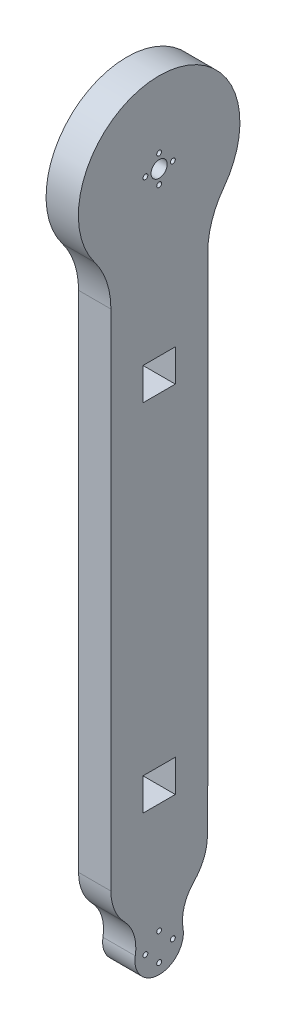
ISO-10303-21;
HEADER;
FILE_DESCRIPTION(('STEP AP214'),'2;1');
FILE_NAME('part.step','',(''),(''),'','','');
FILE_SCHEMA(('AUTOMOTIVE_DESIGN { 1 0 10303 214 1 1 1 1 }'));
ENDSEC;
DATA;
#1=APPLICATION_CONTEXT('core data for automotive mechanical design processes');
#2=APPLICATION_PROTOCOL_DEFINITION('international standard','automotive_design',2000,#1);
#3=PRODUCT_CONTEXT('',#1,'mechanical');
#4=PRODUCT('Part','Part','',(#3));
#5=PRODUCT_RELATED_PRODUCT_CATEGORY('part','',(#4));
#6=PRODUCT_DEFINITION_FORMATION('','',#4);
#7=PRODUCT_DEFINITION_CONTEXT('part definition',#1,'design');
#8=PRODUCT_DEFINITION('design','',#6,#7);
#9=PRODUCT_DEFINITION_SHAPE('','',#8);
#10=(LENGTH_UNIT() NAMED_UNIT(*) SI_UNIT(.MILLI.,.METRE.));
#11=(NAMED_UNIT(*) PLANE_ANGLE_UNIT() SI_UNIT($,.RADIAN.));
#12=(NAMED_UNIT(*) SI_UNIT($,.STERADIAN.) SOLID_ANGLE_UNIT());
#13=UNCERTAINTY_MEASURE_WITH_UNIT(LENGTH_MEASURE(1.E-05),#10,'distance_accuracy_value','');
#14=(GEOMETRIC_REPRESENTATION_CONTEXT(3) GLOBAL_UNCERTAINTY_ASSIGNED_CONTEXT((#13)) GLOBAL_UNIT_ASSIGNED_CONTEXT((#10,
#11,#12)) REPRESENTATION_CONTEXT('',''));
#15=CARTESIAN_POINT('',(0.,0.,0.));
#16=DIRECTION('',(0.,0.,1.));
#17=DIRECTION('',(1.,0.,0.));
#18=AXIS2_PLACEMENT_3D('',#15,#16,#17);
#19=CARTESIAN_POINT('',(10.,109.060958061261,55.));
#20=DIRECTION('',(1.,0.,0.));
#21=DIRECTION('',(0.,0.,-1.));
#22=AXIS2_PLACEMENT_3D('',#19,#20,#21);
#23=PLANE('',#22);
#24=CARTESIAN_POINT('',(10.,139.147777588755,15.0611722663843));
#25=DIRECTION('',(1.,0.,0.));
#26=DIRECTION('',(0.,0.,-1.));
#27=AXIS2_PLACEMENT_3D('',#24,#25,#26);
#28=CIRCLE('',#27,2.5);
#29=CARTESIAN_POINT('',(10.,139.147777588755,12.5611722663843));
#30=VERTEX_POINT('',#29);
#31=EDGE_CURVE('E199',#30,#30,#28,.T.);
#32=ORIENTED_EDGE('',*,*,#31,.F.);
#33=EDGE_LOOP('',(#32));
#34=FACE_BOUND('',#33,.T.);
#35=DIRECTION('',(0.,0.,1.));
#36=VECTOR('',#35,1.);
#37=CARTESIAN_POINT('',(10.,-33.7397338832662,0.));
#38=LINE('',#37,#36);
#39=CARTESIAN_POINT('',(10.,-33.7397338832662,0.));
#40=VERTEX_POINT('',#39);
#41=CARTESIAN_POINT('',(10.,-33.7397338832662,0.122344532768711));
#42=VERTEX_POINT('',#41);
#43=EDGE_CURVE('E173',#40,#42,#38,.T.);
#44=ORIENTED_EDGE('',*,*,#43,.F.);
#45=DIRECTION('',(0.,1.,0.));
#46=VECTOR('',#45,1.);
#47=CARTESIAN_POINT('',(10.,109.224055449648,0.));
#48=LINE('',#47,#46);
#49=CARTESIAN_POINT('',(10.,109.224055449648,0.));
#50=VERTEX_POINT('',#49);
#51=EDGE_CURVE('E354',#40,#50,#48,.T.);
#52=ORIENTED_EDGE('',*,*,#51,.T.);
#53=CARTESIAN_POINT('',(10.,109.224055449648,-25.));
#54=DIRECTION('',(-1.,0.,0.));
#55=DIRECTION('',(0.,0.,1.));
#56=AXIS2_PLACEMENT_3D('',#53,#54,#55);
#57=CIRCLE('',#56,25.);
#58=CARTESIAN_POINT('',(10.,124.184939096712,-4.97072241694613));
#59=VERTEX_POINT('',#58);
#60=EDGE_CURVE('E356',#50,#59,#57,.T.);
#61=ORIENTED_EDGE('',*,*,#60,.T.);
#62=CARTESIAN_POINT('',(10.,139.147777588755,15.0611722663843));
#63=DIRECTION('',(1.,0.,0.));
#64=DIRECTION('',(0.,0.,-1.));
#65=AXIS2_PLACEMENT_3D('',#62,#63,#64);
#66=CIRCLE('',#65,25.0032665934477);
#67=CARTESIAN_POINT('',(10.,124.103385075138,35.0318906870931));
#68=VERTEX_POINT('',#67);
#69=EDGE_CURVE('E358',#59,#68,#66,.T.);
#70=ORIENTED_EDGE('',*,*,#69,.T.);
#71=CARTESIAN_POINT('',(10.,109.060958061261,55.));
#72=DIRECTION('',(-1.,0.,0.));
#73=DIRECTION('',(0.,0.,-1.));
#74=AXIS2_PLACEMENT_3D('',#71,#72,#73);
#75=CIRCLE('',#74,25.);
#76=CARTESIAN_POINT('',(10.,109.060958061261,30.));
#77=VERTEX_POINT('',#76);
#78=EDGE_CURVE('E348',#68,#77,#75,.T.);
#79=ORIENTED_EDGE('',*,*,#78,.T.);
#80=DIRECTION('',(0.,-1.,0.));
#81=VECTOR('',#80,1.);
#82=CARTESIAN_POINT('',(10.,109.060958061261,30.));
#83=LINE('',#82,#81);
#84=CARTESIAN_POINT('',(10.,-46.9560717726586,30.));
#85=VERTEX_POINT('',#84);
#86=EDGE_CURVE('E351',#77,#85,#83,.T.);
#87=ORIENTED_EDGE('',*,*,#86,.T.);
#88=CARTESIAN_POINT('',(10.,-46.9560717726587,15.1038493614138));
#89=DIRECTION('',(1.,0.,0.));
#90=DIRECTION('',(0.,0.,-1.));
#91=AXIS2_PLACEMENT_3D('',#88,#89,#90);
#92=CIRCLE('',#91,14.8961506385862);
#93=CARTESIAN_POINT('',(10.,-57.3205261052865,25.8030731759867));
#94=VERTEX_POINT('',#93);
#95=EDGE_CURVE('E193',#94,#85,#92,.F.);
#96=ORIENTED_EDGE('',*,*,#95,.F.);
#97=CARTESIAN_POINT('',(10.,-66.017785034869,34.7812515609264));
#98=DIRECTION('',(1.,0.,0.));
#99=DIRECTION('',(0.,0.,-1.));
#100=AXIS2_PLACEMENT_3D('',#97,#98,#99);
#101=CIRCLE('',#100,12.5);
#102=CARTESIAN_POINT('',(10.,-68.1018083951039,22.4562020018376));
#103=VERTEX_POINT('',#102);
#104=EDGE_CURVE('E196',#103,#94,#101,.T.);
#105=ORIENTED_EDGE('',*,*,#104,.F.);
#106=CARTESIAN_POINT('',(10.,-69.3522224112449,15.0611722663843));
#107=DIRECTION('',(1.,0.,0.));
#108=DIRECTION('',(0.,0.,-1.));
#109=AXIS2_PLACEMENT_3D('',#106,#107,#108);
#110=CIRCLE('',#109,7.5);
#111=CARTESIAN_POINT('',(10.,-68.1018083951039,7.66614253093106));
#112=VERTEX_POINT('',#111);
#113=EDGE_CURVE('E222',#103,#112,#110,.T.);
#114=ORIENTED_EDGE('',*,*,#113,.T.);
#115=CARTESIAN_POINT('',(10.,-66.0177850348689,-4.65890702815774));
#116=DIRECTION('',(1.,0.,0.));
#117=DIRECTION('',(0.,0.,-1.));
#118=AXIS2_PLACEMENT_3D('',#115,#116,#117);
#119=CIRCLE('',#118,12.5);
#120=CARTESIAN_POINT('',(10.,-57.3205261052865,4.31927135678201));
#121=VERTEX_POINT('',#120);
#122=EDGE_CURVE('E219',#112,#121,#119,.F.);
#123=ORIENTED_EDGE('',*,*,#122,.T.);
#124=CARTESIAN_POINT('',(10.,-46.9560717726587,15.0184951713549));
#125=DIRECTION('',(1.,0.,0.));
#126=DIRECTION('',(0.,0.,-1.));
#127=AXIS2_PLACEMENT_3D('',#124,#125,#126);
#128=CIRCLE('',#127,14.8961506385862);
#129=CARTESIAN_POINT('',(10.,-46.9560717726586,0.122344532768704));
#130=VERTEX_POINT('',#129);
#131=EDGE_CURVE('E216',#121,#130,#128,.T.);
#132=ORIENTED_EDGE('',*,*,#131,.T.);
#133=DIRECTION('',(0.,-1.,0.));
#134=VECTOR('',#133,1.);
#135=CARTESIAN_POINT('',(10.,0.,0.122344532768729));
#136=LINE('',#135,#134);
#137=EDGE_CURVE('E213',#42,#130,#136,.T.);
#138=ORIENTED_EDGE('',*,*,#137,.F.);
#139=EDGE_LOOP('',(#44,#52,#61,#70,#79,#87,#96,#105,#114,#123,#132,#138));
#140=FACE_BOUND('',#139,.T.);
#141=CARTESIAN_POINT('',(10.,-69.3522224112449,19.3111722663843));
#142=DIRECTION('',(1.,0.,0.));
#143=DIRECTION('',(0.,0.,-1.));
#144=AXIS2_PLACEMENT_3D('',#141,#142,#143);
#145=CIRCLE('',#144,0.750000000000002);
#146=CARTESIAN_POINT('',(10.,-69.3522224112449,18.5611722663843));
#147=VERTEX_POINT('',#146);
#148=EDGE_CURVE('E244',#147,#147,#145,.T.);
#149=ORIENTED_EDGE('',*,*,#148,.F.);
#150=EDGE_LOOP('',(#149));
#151=FACE_BOUND('',#150,.T.);
#152=CARTESIAN_POINT('',(10.,-69.3522224112449,10.8111722663843));
#153=DIRECTION('',(1.,0.,0.));
#154=DIRECTION('',(0.,0.,-1.));
#155=AXIS2_PLACEMENT_3D('',#152,#153,#154);
#156=CIRCLE('',#155,0.75);
#157=CARTESIAN_POINT('',(10.,-69.3522224112449,10.0611722663843));
#158=VERTEX_POINT('',#157);
#159=EDGE_CURVE('E250',#158,#158,#156,.T.);
#160=ORIENTED_EDGE('',*,*,#159,.F.);
#161=EDGE_LOOP('',(#160));
#162=FACE_BOUND('',#161,.T.);
#163=CARTESIAN_POINT('',(10.,-73.6022224112449,15.0611722663843));
#164=DIRECTION('',(1.,0.,0.));
#165=DIRECTION('',(0.,0.,-1.));
#166=AXIS2_PLACEMENT_3D('',#163,#164,#165);
#167=CIRCLE('',#166,0.75);
#168=CARTESIAN_POINT('',(10.,-73.6022224112449,14.3111722663843));
#169=VERTEX_POINT('',#168);
#170=EDGE_CURVE('E230',#169,#169,#167,.T.);
#171=ORIENTED_EDGE('',*,*,#170,.F.);
#172=EDGE_LOOP('',(#171));
#173=FACE_BOUND('',#172,.T.);
#174=CARTESIAN_POINT('',(10.,-65.1022224112449,15.0611722663843));
#175=DIRECTION('',(1.,0.,0.));
#176=DIRECTION('',(0.,0.,-1.));
#177=AXIS2_PLACEMENT_3D('',#174,#175,#176);
#178=CIRCLE('',#177,0.75);
#179=CARTESIAN_POINT('',(10.,-65.1022224112449,14.3111722663843));
#180=VERTEX_POINT('',#179);
#181=EDGE_CURVE('E243',#180,#180,#178,.T.);
#182=ORIENTED_EDGE('',*,*,#181,.F.);
#183=EDGE_LOOP('',(#182));
#184=FACE_BOUND('',#183,.T.);
#185=CARTESIAN_POINT('',(10.,143.397777588755,15.0611722663843));
#186=DIRECTION('',(1.,0.,0.));
#187=DIRECTION('',(0.,0.,-1.));
#188=AXIS2_PLACEMENT_3D('',#185,#186,#187);
#189=CIRCLE('',#188,0.75);
#190=CARTESIAN_POINT('',(10.,143.397777588755,14.3111722663843));
#191=VERTEX_POINT('',#190);
#192=EDGE_CURVE('E268',#191,#191,#189,.T.);
#193=ORIENTED_EDGE('',*,*,#192,.F.);
#194=EDGE_LOOP('',(#193));
#195=FACE_BOUND('',#194,.T.);
#196=CARTESIAN_POINT('',(10.,139.147777588755,10.8111722663843));
#197=DIRECTION('',(1.,0.,0.));
#198=DIRECTION('',(0.,0.,-1.));
#199=AXIS2_PLACEMENT_3D('',#196,#197,#198);
#200=CIRCLE('',#199,0.75);
#201=CARTESIAN_POINT('',(10.,139.147777588755,10.0611722663843));
#202=VERTEX_POINT('',#201);
#203=EDGE_CURVE('E274',#202,#202,#200,.T.);
#204=ORIENTED_EDGE('',*,*,#203,.F.);
#205=EDGE_LOOP('',(#204));
#206=FACE_BOUND('',#205,.T.);
#207=CARTESIAN_POINT('',(10.,134.897777588755,15.0611722663843));
#208=DIRECTION('',(1.,0.,0.));
#209=DIRECTION('',(0.,0.,-1.));
#210=AXIS2_PLACEMENT_3D('',#207,#208,#209);
#211=CIRCLE('',#210,0.75);
#212=CARTESIAN_POINT('',(10.,134.897777588755,14.3111722663843));
#213=VERTEX_POINT('',#212);
#214=EDGE_CURVE('E261',#213,#213,#211,.T.);
#215=ORIENTED_EDGE('',*,*,#214,.F.);
#216=EDGE_LOOP('',(#215));
#217=FACE_BOUND('',#216,.T.);
#218=CARTESIAN_POINT('',(10.,139.147777588755,19.3111722663843));
#219=DIRECTION('',(1.,0.,0.));
#220=DIRECTION('',(0.,0.,-1.));
#221=AXIS2_PLACEMENT_3D('',#218,#219,#220);
#222=CIRCLE('',#221,0.750000000000002);
#223=CARTESIAN_POINT('',(10.,139.147777588755,18.5611722663843));
#224=VERTEX_POINT('',#223);
#225=EDGE_CURVE('E267',#224,#224,#222,.T.);
#226=ORIENTED_EDGE('',*,*,#225,.F.);
#227=EDGE_LOOP('',(#226));
#228=FACE_BOUND('',#227,.T.);
#229=DIRECTION('',(0.,0.,-1.));
#230=VECTOR('',#229,1.);
#231=CARTESIAN_POINT('',(10.,78.9590862581429,10.0611722663844));
#232=LINE('',#231,#230);
#233=CARTESIAN_POINT('',(10.,78.9590862581429,20.0611722663844));
#234=VERTEX_POINT('',#233);
#235=CARTESIAN_POINT('',(10.,78.9590862581429,10.0611722663844));
#236=VERTEX_POINT('',#235);
#237=EDGE_CURVE('E319',#234,#236,#232,.T.);
#238=ORIENTED_EDGE('',*,*,#237,.F.);
#239=DIRECTION('',(0.,-1.,0.));
#240=VECTOR('',#239,1.);
#241=CARTESIAN_POINT('',(10.,78.9590862581429,20.0611722663844));
#242=LINE('',#241,#240);
#243=CARTESIAN_POINT('',(10.,88.9590862581429,20.0611722663844));
#244=VERTEX_POINT('',#243);
#245=EDGE_CURVE('E317',#244,#234,#242,.T.);
#246=ORIENTED_EDGE('',*,*,#245,.F.);
#247=DIRECTION('',(0.,0.,1.));
#248=VECTOR('',#247,1.);
#249=CARTESIAN_POINT('',(10.,88.9590862581429,20.0611722663844));
#250=LINE('',#249,#248);
#251=CARTESIAN_POINT('',(10.,88.9590862581429,10.0611722663844));
#252=VERTEX_POINT('',#251);
#253=EDGE_CURVE('E325',#252,#244,#250,.T.);
#254=ORIENTED_EDGE('',*,*,#253,.F.);
#255=DIRECTION('',(0.,1.,0.));
#256=VECTOR('',#255,1.);
#257=CARTESIAN_POINT('',(10.,88.9590862581429,10.0611722663844));
#258=LINE('',#257,#256);
#259=EDGE_CURVE('E322',#236,#252,#258,.T.);
#260=ORIENTED_EDGE('',*,*,#259,.F.);
#261=EDGE_LOOP('',(#238,#246,#254,#260));
#262=FACE_BOUND('',#261,.T.);
#263=DIRECTION('',(0.,0.,1.));
#264=VECTOR('',#263,1.);
#265=CARTESIAN_POINT('',(10.,-21.0409137418571,10.0611722663844));
#266=LINE('',#265,#264);
#267=CARTESIAN_POINT('',(10.,-21.0409137418571,10.0611722663844));
#268=VERTEX_POINT('',#267);
#269=CARTESIAN_POINT('',(10.,-21.0409137418571,20.0611722663844));
#270=VERTEX_POINT('',#269);
#271=EDGE_CURVE('E290',#268,#270,#266,.T.);
#272=ORIENTED_EDGE('',*,*,#271,.F.);
#273=DIRECTION('',(0.,1.,0.));
#274=VECTOR('',#273,1.);
#275=CARTESIAN_POINT('',(10.,-31.0409137418571,10.0611722663843));
#276=LINE('',#275,#274);
#277=CARTESIAN_POINT('',(10.,-31.0409137418571,10.0611722663843));
#278=VERTEX_POINT('',#277);
#279=EDGE_CURVE('E288',#278,#268,#276,.T.);
#280=ORIENTED_EDGE('',*,*,#279,.F.);
#281=DIRECTION('',(0.,0.,-1.));
#282=VECTOR('',#281,1.);
#283=CARTESIAN_POINT('',(10.,-31.0409137418571,20.0611722663843));
#284=LINE('',#283,#282);
#285=CARTESIAN_POINT('',(10.,-31.0409137418571,20.0611722663843));
#286=VERTEX_POINT('',#285);
#287=EDGE_CURVE('E295',#286,#278,#284,.T.);
#288=ORIENTED_EDGE('',*,*,#287,.F.);
#289=DIRECTION('',(0.,-1.,0.));
#290=VECTOR('',#289,1.);
#291=CARTESIAN_POINT('',(10.,-21.0409137418571,20.0611722663844));
#292=LINE('',#291,#290);
#293=EDGE_CURVE('E293',#270,#286,#292,.T.);
#294=ORIENTED_EDGE('',*,*,#293,.F.);
#295=EDGE_LOOP('',(#272,#280,#288,#294));
#296=FACE_BOUND('',#295,.T.);
#297=ADVANCED_FACE('F35',(#34,#140,#151,#162,#173,#184,#195,#206,#217,#228,#262,#296),#23,.T.);
#298=CARTESIAN_POINT('',(0.,109.060958061261,55.));
#299=DIRECTION('',(1.,0.,0.));
#300=DIRECTION('',(0.,0.,-1.));
#301=AXIS2_PLACEMENT_3D('',#298,#299,#300);
#302=PLANE('',#301);
#303=CARTESIAN_POINT('',(0.,139.147777588755,15.0611722663843));
#304=DIRECTION('',(1.,0.,0.));
#305=DIRECTION('',(0.,0.,-1.));
#306=AXIS2_PLACEMENT_3D('',#303,#304,#305);
#307=CIRCLE('',#306,2.5);
#308=CARTESIAN_POINT('',(0.,139.147777588755,12.5611722663843));
#309=VERTEX_POINT('',#308);
#310=EDGE_CURVE('E214',#309,#309,#307,.T.);
#311=ORIENTED_EDGE('',*,*,#310,.T.);
#312=EDGE_LOOP('',(#311));
#313=FACE_BOUND('',#312,.T.);
#314=CARTESIAN_POINT('',(0.,-69.3522224112449,19.3111722663843));
#315=DIRECTION('',(1.,0.,0.));
#316=DIRECTION('',(0.,0.,-1.));
#317=AXIS2_PLACEMENT_3D('',#314,#315,#316);
#318=CIRCLE('',#317,0.750000000000002);
#319=CARTESIAN_POINT('',(0.,-69.3522224112449,18.5611722663843));
#320=VERTEX_POINT('',#319);
#321=EDGE_CURVE('E240',#320,#320,#318,.T.);
#322=ORIENTED_EDGE('',*,*,#321,.T.);
#323=EDGE_LOOP('',(#322));
#324=FACE_BOUND('',#323,.T.);
#325=CARTESIAN_POINT('',(0.,-69.3522224112449,10.8111722663843));
#326=DIRECTION('',(1.,0.,0.));
#327=DIRECTION('',(0.,0.,-1.));
#328=AXIS2_PLACEMENT_3D('',#325,#326,#327);
#329=CIRCLE('',#328,0.75);
#330=CARTESIAN_POINT('',(0.,-69.3522224112449,10.0611722663843));
#331=VERTEX_POINT('',#330);
#332=EDGE_CURVE('E247',#331,#331,#329,.T.);
#333=ORIENTED_EDGE('',*,*,#332,.T.);
#334=EDGE_LOOP('',(#333));
#335=FACE_BOUND('',#334,.T.);
#336=CARTESIAN_POINT('',(0.,-73.6022224112449,15.0611722663843));
#337=DIRECTION('',(1.,0.,0.));
#338=DIRECTION('',(0.,0.,-1.));
#339=AXIS2_PLACEMENT_3D('',#336,#337,#338);
#340=CIRCLE('',#339,0.75);
#341=CARTESIAN_POINT('',(0.,-73.6022224112449,14.3111722663843));
#342=VERTEX_POINT('',#341);
#343=EDGE_CURVE('E253',#342,#342,#340,.T.);
#344=ORIENTED_EDGE('',*,*,#343,.T.);
#345=EDGE_LOOP('',(#344));
#346=FACE_BOUND('',#345,.T.);
#347=CARTESIAN_POINT('',(0.,-65.1022224112449,15.0611722663843));
#348=DIRECTION('',(1.,0.,0.));
#349=DIRECTION('',(0.,0.,-1.));
#350=AXIS2_PLACEMENT_3D('',#347,#348,#349);
#351=CIRCLE('',#350,0.75);
#352=CARTESIAN_POINT('',(0.,-65.1022224112449,14.3111722663843));
#353=VERTEX_POINT('',#352);
#354=EDGE_CURVE('E258',#353,#353,#351,.T.);
#355=ORIENTED_EDGE('',*,*,#354,.T.);
#356=EDGE_LOOP('',(#355));
#357=FACE_BOUND('',#356,.T.);
#358=CARTESIAN_POINT('',(0.,143.397777588755,15.0611722663843));
#359=DIRECTION('',(1.,0.,0.));
#360=DIRECTION('',(0.,0.,-1.));
#361=AXIS2_PLACEMENT_3D('',#358,#359,#360);
#362=CIRCLE('',#361,0.75);
#363=CARTESIAN_POINT('',(0.,143.397777588755,14.3111722663843));
#364=VERTEX_POINT('',#363);
#365=EDGE_CURVE('E264',#364,#364,#362,.T.);
#366=ORIENTED_EDGE('',*,*,#365,.T.);
#367=EDGE_LOOP('',(#366));
#368=FACE_BOUND('',#367,.T.);
#369=CARTESIAN_POINT('',(0.,139.147777588755,10.8111722663843));
#370=DIRECTION('',(1.,0.,0.));
#371=DIRECTION('',(0.,0.,-1.));
#372=AXIS2_PLACEMENT_3D('',#369,#370,#371);
#373=CIRCLE('',#372,0.75);
#374=CARTESIAN_POINT('',(0.,139.147777588755,10.0611722663843));
#375=VERTEX_POINT('',#374);
#376=EDGE_CURVE('E271',#375,#375,#373,.T.);
#377=ORIENTED_EDGE('',*,*,#376,.T.);
#378=EDGE_LOOP('',(#377));
#379=FACE_BOUND('',#378,.T.);
#380=CARTESIAN_POINT('',(0.,134.897777588755,15.0611722663843));
#381=DIRECTION('',(1.,0.,0.));
#382=DIRECTION('',(0.,0.,-1.));
#383=AXIS2_PLACEMENT_3D('',#380,#381,#382);
#384=CIRCLE('',#383,0.75);
#385=CARTESIAN_POINT('',(0.,134.897777588755,14.3111722663843));
#386=VERTEX_POINT('',#385);
#387=EDGE_CURVE('E277',#386,#386,#384,.T.);
#388=ORIENTED_EDGE('',*,*,#387,.T.);
#389=EDGE_LOOP('',(#388));
#390=FACE_BOUND('',#389,.T.);
#391=CARTESIAN_POINT('',(0.,139.147777588755,19.3111722663843));
#392=DIRECTION('',(1.,0.,0.));
#393=DIRECTION('',(0.,0.,-1.));
#394=AXIS2_PLACEMENT_3D('',#391,#392,#393);
#395=CIRCLE('',#394,0.750000000000002);
#396=CARTESIAN_POINT('',(0.,139.147777588755,18.5611722663843));
#397=VERTEX_POINT('',#396);
#398=EDGE_CURVE('E282',#397,#397,#395,.T.);
#399=ORIENTED_EDGE('',*,*,#398,.T.);
#400=EDGE_LOOP('',(#399));
#401=FACE_BOUND('',#400,.T.);
#402=DIRECTION('',(0.,-1.,0.));
#403=VECTOR('',#402,1.);
#404=CARTESIAN_POINT('',(0.,78.9590862581429,20.0611722663844));
#405=LINE('',#404,#403);
#406=CARTESIAN_POINT('',(0.,88.9590862581429,20.0611722663844));
#407=VERTEX_POINT('',#406);
#408=CARTESIAN_POINT('',(0.,78.9590862581429,20.0611722663844));
#409=VERTEX_POINT('',#408);
#410=EDGE_CURVE('E316',#407,#409,#405,.T.);
#411=ORIENTED_EDGE('',*,*,#410,.T.);
#412=DIRECTION('',(0.,0.,-1.));
#413=VECTOR('',#412,1.);
#414=CARTESIAN_POINT('',(0.,78.9590862581429,10.0611722663844));
#415=LINE('',#414,#413);
#416=CARTESIAN_POINT('',(0.,78.9590862581429,10.0611722663844));
#417=VERTEX_POINT('',#416);
#418=EDGE_CURVE('E330',#409,#417,#415,.T.);
#419=ORIENTED_EDGE('',*,*,#418,.T.);
#420=DIRECTION('',(0.,1.,0.));
#421=VECTOR('',#420,1.);
#422=CARTESIAN_POINT('',(0.,88.9590862581429,10.0611722663844));
#423=LINE('',#422,#421);
#424=CARTESIAN_POINT('',(0.,88.9590862581429,10.0611722663844));
#425=VERTEX_POINT('',#424);
#426=EDGE_CURVE('E333',#417,#425,#423,.T.);
#427=ORIENTED_EDGE('',*,*,#426,.T.);
#428=DIRECTION('',(0.,0.,1.));
#429=VECTOR('',#428,1.);
#430=CARTESIAN_POINT('',(0.,88.9590862581429,20.0611722663844));
#431=LINE('',#430,#429);
#432=EDGE_CURVE('E320',#425,#407,#431,.T.);
#433=ORIENTED_EDGE('',*,*,#432,.T.);
#434=EDGE_LOOP('',(#411,#419,#427,#433));
#435=FACE_BOUND('',#434,.T.);
#436=DIRECTION('',(0.,1.,0.));
#437=VECTOR('',#436,1.);
#438=CARTESIAN_POINT('',(0.,109.224055449648,0.));
#439=LINE('',#438,#437);
#440=CARTESIAN_POINT('',(0.,-33.7397338832662,0.));
#441=VERTEX_POINT('',#440);
#442=CARTESIAN_POINT('',(0.,109.224055449648,0.));
#443=VERTEX_POINT('',#442);
#444=EDGE_CURVE('E192',#441,#443,#439,.T.);
#445=ORIENTED_EDGE('',*,*,#444,.F.);
#446=DIRECTION('',(0.,0.,1.));
#447=VECTOR('',#446,1.);
#448=CARTESIAN_POINT('',(0.,-33.7397338832662,0.));
#449=LINE('',#448,#447);
#450=CARTESIAN_POINT('',(0.,-33.7397338832662,0.122344532768711));
#451=VERTEX_POINT('',#450);
#452=EDGE_CURVE('E50',#441,#451,#449,.T.);
#453=ORIENTED_EDGE('',*,*,#452,.T.);
#454=DIRECTION('',(0.,-1.,0.));
#455=VECTOR('',#454,1.);
#456=CARTESIAN_POINT('',(0.,0.,0.122344532768729));
#457=LINE('',#456,#455);
#458=CARTESIAN_POINT('',(0.,-46.9560717726586,0.122344532768704));
#459=VERTEX_POINT('',#458);
#460=EDGE_CURVE('E182',#451,#459,#457,.T.);
#461=ORIENTED_EDGE('',*,*,#460,.T.);
#462=CARTESIAN_POINT('',(0.,-46.9560717726587,15.0184951713549));
#463=DIRECTION('',(1.,0.,0.));
#464=DIRECTION('',(0.,0.,-1.));
#465=AXIS2_PLACEMENT_3D('',#462,#463,#464);
#466=CIRCLE('',#465,14.8961506385862);
#467=CARTESIAN_POINT('',(0.,-57.3205261052865,4.31927135678201));
#468=VERTEX_POINT('',#467);
#469=EDGE_CURVE('E186',#468,#459,#466,.T.);
#470=ORIENTED_EDGE('',*,*,#469,.F.);
#471=CARTESIAN_POINT('',(0.,-66.0177850348689,-4.65890702815774));
#472=DIRECTION('',(1.,0.,0.));
#473=DIRECTION('',(0.,0.,-1.));
#474=AXIS2_PLACEMENT_3D('',#471,#472,#473);
#475=CIRCLE('',#474,12.5);
#476=CARTESIAN_POINT('',(0.,-68.1018083951039,7.66614253093106));
#477=VERTEX_POINT('',#476);
#478=EDGE_CURVE('E203',#477,#468,#475,.F.);
#479=ORIENTED_EDGE('',*,*,#478,.F.);
#480=CARTESIAN_POINT('',(0.,-69.3522224112449,15.0611722663843));
#481=DIRECTION('',(1.,0.,0.));
#482=DIRECTION('',(0.,0.,-1.));
#483=AXIS2_PLACEMENT_3D('',#480,#481,#482);
#484=CIRCLE('',#483,7.5);
#485=CARTESIAN_POINT('',(0.,-68.1018083951039,22.4562020018376));
#486=VERTEX_POINT('',#485);
#487=EDGE_CURVE('E205',#486,#477,#484,.T.);
#488=ORIENTED_EDGE('',*,*,#487,.F.);
#489=CARTESIAN_POINT('',(0.,-66.017785034869,34.7812515609264));
#490=DIRECTION('',(1.,0.,0.));
#491=DIRECTION('',(0.,0.,-1.));
#492=AXIS2_PLACEMENT_3D('',#489,#490,#491);
#493=CIRCLE('',#492,12.5);
#494=CARTESIAN_POINT('',(0.,-57.3205261052865,25.8030731759867));
#495=VERTEX_POINT('',#494);
#496=EDGE_CURVE('E207',#486,#495,#493,.T.);
#497=ORIENTED_EDGE('',*,*,#496,.T.);
#498=CARTESIAN_POINT('',(0.,-46.9560717726587,15.1038493614138));
#499=DIRECTION('',(1.,0.,0.));
#500=DIRECTION('',(0.,0.,-1.));
#501=AXIS2_PLACEMENT_3D('',#498,#499,#500);
#502=CIRCLE('',#501,14.8961506385862);
#503=CARTESIAN_POINT('',(0.,-46.9560717726586,30.));
#504=VERTEX_POINT('',#503);
#505=EDGE_CURVE('E178',#495,#504,#502,.F.);
#506=ORIENTED_EDGE('',*,*,#505,.T.);
#507=DIRECTION('',(0.,-1.,0.));
#508=VECTOR('',#507,1.);
#509=CARTESIAN_POINT('',(0.,109.060958061261,30.));
#510=LINE('',#509,#508);
#511=CARTESIAN_POINT('',(0.,109.060958061261,30.));
#512=VERTEX_POINT('',#511);
#513=EDGE_CURVE('E363',#512,#504,#510,.T.);
#514=ORIENTED_EDGE('',*,*,#513,.F.);
#515=CARTESIAN_POINT('',(0.,109.060958061261,55.));
#516=DIRECTION('',(-1.,0.,0.));
#517=DIRECTION('',(0.,0.,-1.));
#518=AXIS2_PLACEMENT_3D('',#515,#516,#517);
#519=CIRCLE('',#518,25.);
#520=CARTESIAN_POINT('',(0.,124.103385075138,35.0318906870931));
#521=VERTEX_POINT('',#520);
#522=EDGE_CURVE('E347',#521,#512,#519,.T.);
#523=ORIENTED_EDGE('',*,*,#522,.F.);
#524=CARTESIAN_POINT('',(0.,139.147777588755,15.0611722663843));
#525=DIRECTION('',(1.,0.,0.));
#526=DIRECTION('',(0.,0.,-1.));
#527=AXIS2_PLACEMENT_3D('',#524,#525,#526);
#528=CIRCLE('',#527,25.0032665934477);
#529=CARTESIAN_POINT('',(0.,124.184939096712,-4.97072241694613));
#530=VERTEX_POINT('',#529);
#531=EDGE_CURVE('E352',#530,#521,#528,.T.);
#532=ORIENTED_EDGE('',*,*,#531,.F.);
#533=CARTESIAN_POINT('',(0.,109.224055449648,-25.));
#534=DIRECTION('',(-1.,0.,0.));
#535=DIRECTION('',(0.,0.,1.));
#536=AXIS2_PLACEMENT_3D('',#533,#534,#535);
#537=CIRCLE('',#536,25.);
#538=EDGE_CURVE('E366',#443,#530,#537,.T.);
#539=ORIENTED_EDGE('',*,*,#538,.F.);
#540=EDGE_LOOP('',(#445,#453,#461,#470,#479,#488,#497,#506,#514,#523,#532,#539));
#541=FACE_BOUND('',#540,.T.);
#542=DIRECTION('',(0.,1.,0.));
#543=VECTOR('',#542,1.);
#544=CARTESIAN_POINT('',(0.,-31.0409137418571,10.0611722663843));
#545=LINE('',#544,#543);
#546=CARTESIAN_POINT('',(0.,-31.0409137418571,10.0611722663843));
#547=VERTEX_POINT('',#546);
#548=CARTESIAN_POINT('',(0.,-21.0409137418571,10.0611722663844));
#549=VERTEX_POINT('',#548);
#550=EDGE_CURVE('E285',#547,#549,#545,.T.);
#551=ORIENTED_EDGE('',*,*,#550,.T.);
#552=DIRECTION('',(0.,0.,1.));
#553=VECTOR('',#552,1.);
#554=CARTESIAN_POINT('',(0.,-21.0409137418571,10.0611722663844));
#555=LINE('',#554,#553);
#556=CARTESIAN_POINT('',(0.,-21.0409137418571,20.0611722663844));
#557=VERTEX_POINT('',#556);
#558=EDGE_CURVE('E300',#549,#557,#555,.T.);
#559=ORIENTED_EDGE('',*,*,#558,.T.);
#560=DIRECTION('',(0.,-1.,0.));
#561=VECTOR('',#560,1.);
#562=CARTESIAN_POINT('',(0.,-21.0409137418571,20.0611722663844));
#563=LINE('',#562,#561);
#564=CARTESIAN_POINT('',(0.,-31.0409137418571,20.0611722663843));
#565=VERTEX_POINT('',#564);
#566=EDGE_CURVE('E303',#557,#565,#563,.T.);
#567=ORIENTED_EDGE('',*,*,#566,.T.);
#568=DIRECTION('',(0.,0.,-1.));
#569=VECTOR('',#568,1.);
#570=CARTESIAN_POINT('',(0.,-31.0409137418571,20.0611722663843));
#571=LINE('',#570,#569);
#572=EDGE_CURVE('E291',#565,#547,#571,.T.);
#573=ORIENTED_EDGE('',*,*,#572,.T.);
#574=EDGE_LOOP('',(#551,#559,#567,#573));
#575=FACE_BOUND('',#574,.T.);
#576=ADVANCED_FACE('F189',(#313,#324,#335,#346,#357,#368,#379,#390,#401,#435,#541,#575),#302,.F.);
#577=CARTESIAN_POINT('',(10.,109.060958061261,55.));
#578=DIRECTION('',(-1.,0.,0.));
#579=DIRECTION('',(0.,0.,1.));
#580=AXIS2_PLACEMENT_3D('',#577,#578,#579);
#581=CYLINDRICAL_SURFACE('',#580,25.);
#582=ORIENTED_EDGE('',*,*,#522,.T.);
#583=DIRECTION('',(-1.,0.,0.));
#584=VECTOR('',#583,1.);
#585=CARTESIAN_POINT('',(10.,109.060958061261,30.));
#586=LINE('',#585,#584);
#587=EDGE_CURVE('E43',#77,#512,#586,.T.);
#588=ORIENTED_EDGE('',*,*,#587,.F.);
#589=ORIENTED_EDGE('',*,*,#78,.F.);
#590=DIRECTION('',(-1.,0.,0.));
#591=VECTOR('',#590,1.);
#592=CARTESIAN_POINT('',(10.,124.103385075138,35.0318906870931));
#593=LINE('',#592,#591);
#594=EDGE_CURVE('E360',#68,#521,#593,.T.);
#595=ORIENTED_EDGE('',*,*,#594,.T.);
#596=EDGE_LOOP('',(#582,#588,#589,#595));
#597=FACE_BOUND('',#596,.T.);
#598=ADVANCED_FACE('F37',(#597),#581,.F.);
#599=CARTESIAN_POINT('',(10.,109.060958061261,30.));
#600=DIRECTION('',(0.,0.,-1.));
#601=DIRECTION('',(0.,1.,0.));
#602=AXIS2_PLACEMENT_3D('',#599,#600,#601);
#603=PLANE('',#602);
#604=ORIENTED_EDGE('',*,*,#513,.T.);
#605=DIRECTION('',(1.,0.,0.));
#606=VECTOR('',#605,1.);
#607=CARTESIAN_POINT('',(0.,-46.9560717726586,30.));
#608=LINE('',#607,#606);
#609=EDGE_CURVE('E227',#504,#85,#608,.T.);
#610=ORIENTED_EDGE('',*,*,#609,.T.);
#611=ORIENTED_EDGE('',*,*,#86,.F.);
#612=ORIENTED_EDGE('',*,*,#587,.T.);
#613=EDGE_LOOP('',(#604,#610,#611,#612));
#614=FACE_BOUND('',#613,.T.);
#615=ADVANCED_FACE('F379',(#614),#603,.F.);
#616=CARTESIAN_POINT('',(10.,109.224055449648,0.));
#617=DIRECTION('',(0.,0.,1.));
#618=DIRECTION('',(0.,-1.,0.));
#619=AXIS2_PLACEMENT_3D('',#616,#617,#618);
#620=PLANE('',#619);
#621=ORIENTED_EDGE('',*,*,#51,.F.);
#622=DIRECTION('',(-1.,0.,0.));
#623=VECTOR('',#622,1.);
#624=CARTESIAN_POINT('',(10.,-33.7397338832662,0.));
#625=LINE('',#624,#623);
#626=EDGE_CURVE('E11',#40,#441,#625,.T.);
#627=ORIENTED_EDGE('',*,*,#626,.T.);
#628=ORIENTED_EDGE('',*,*,#444,.T.);
#629=DIRECTION('',(-1.,0.,0.));
#630=VECTOR('',#629,1.);
#631=CARTESIAN_POINT('',(10.,109.224055449648,0.));
#632=LINE('',#631,#630);
#633=EDGE_CURVE('E374',#50,#443,#632,.T.);
#634=ORIENTED_EDGE('',*,*,#633,.F.);
#635=EDGE_LOOP('',(#621,#627,#628,#634));
#636=FACE_BOUND('',#635,.T.);
#637=ADVANCED_FACE('F405',(#636),#620,.F.);
#638=CARTESIAN_POINT('',(10.,109.224055449648,-25.));
#639=DIRECTION('',(-1.,0.,0.));
#640=DIRECTION('',(0.,0.,1.));
#641=AXIS2_PLACEMENT_3D('',#638,#639,#640);
#642=CYLINDRICAL_SURFACE('',#641,25.);
#643=ORIENTED_EDGE('',*,*,#538,.T.);
#644=DIRECTION('',(-1.,0.,0.));
#645=VECTOR('',#644,1.);
#646=CARTESIAN_POINT('',(10.,124.184939096712,-4.97072241694613));
#647=LINE('',#646,#645);
#648=EDGE_CURVE('E371',#59,#530,#647,.T.);
#649=ORIENTED_EDGE('',*,*,#648,.F.);
#650=ORIENTED_EDGE('',*,*,#60,.F.);
#651=ORIENTED_EDGE('',*,*,#633,.T.);
#652=EDGE_LOOP('',(#643,#649,#650,#651));
#653=FACE_BOUND('',#652,.T.);
#654=ADVANCED_FACE('F401',(#653),#642,.F.);
#655=CARTESIAN_POINT('',(10.,139.147777588755,15.0611722663843));
#656=DIRECTION('',(-1.,0.,0.));
#657=DIRECTION('',(0.,0.,1.));
#658=AXIS2_PLACEMENT_3D('',#655,#656,#657);
#659=CYLINDRICAL_SURFACE('',#658,25.0032665934477);
#660=ORIENTED_EDGE('',*,*,#531,.T.);
#661=ORIENTED_EDGE('',*,*,#594,.F.);
#662=ORIENTED_EDGE('',*,*,#69,.F.);
#663=ORIENTED_EDGE('',*,*,#648,.T.);
#664=EDGE_LOOP('',(#660,#661,#662,#663));
#665=FACE_BOUND('',#664,.T.);
#666=ADVANCED_FACE('F399',(#665),#659,.T.);
#667=CARTESIAN_POINT('',(10.,78.9590862581429,20.0611722663844));
#668=DIRECTION('',(0.,0.,-1.));
#669=DIRECTION('',(-1.,0.,0.));
#670=AXIS2_PLACEMENT_3D('',#667,#668,#669);
#671=PLANE('',#670);
#672=ORIENTED_EDGE('',*,*,#410,.F.);
#673=DIRECTION('',(-1.,0.,0.));
#674=VECTOR('',#673,1.);
#675=CARTESIAN_POINT('',(10.,88.9590862581429,20.0611722663844));
#676=LINE('',#675,#674);
#677=EDGE_CURVE('E327',#244,#407,#676,.T.);
#678=ORIENTED_EDGE('',*,*,#677,.F.);
#679=ORIENTED_EDGE('',*,*,#245,.T.);
#680=DIRECTION('',(-1.,0.,0.));
#681=VECTOR('',#680,1.);
#682=CARTESIAN_POINT('',(10.,78.9590862581429,20.0611722663844));
#683=LINE('',#682,#681);
#684=EDGE_CURVE('E344',#234,#409,#683,.T.);
#685=ORIENTED_EDGE('',*,*,#684,.T.);
#686=EDGE_LOOP('',(#672,#678,#679,#685));
#687=FACE_BOUND('',#686,.T.);
#688=ADVANCED_FACE('F438',(#687),#671,.T.);
#689=CARTESIAN_POINT('',(10.,78.9590862581429,10.0611722663844));
#690=DIRECTION('',(0.,1.,0.));
#691=DIRECTION('',(0.,0.,1.));
#692=AXIS2_PLACEMENT_3D('',#689,#690,#691);
#693=PLANE('',#692);
#694=ORIENTED_EDGE('',*,*,#418,.F.);
#695=ORIENTED_EDGE('',*,*,#684,.F.);
#696=ORIENTED_EDGE('',*,*,#237,.T.);
#697=DIRECTION('',(-1.,0.,0.));
#698=VECTOR('',#697,1.);
#699=CARTESIAN_POINT('',(10.,78.9590862581429,10.0611722663844));
#700=LINE('',#699,#698);
#701=EDGE_CURVE('E342',#236,#417,#700,.T.);
#702=ORIENTED_EDGE('',*,*,#701,.T.);
#703=EDGE_LOOP('',(#694,#695,#696,#702));
#704=FACE_BOUND('',#703,.T.);
#705=ADVANCED_FACE('F663',(#704),#693,.T.);
#706=CARTESIAN_POINT('',(10.,88.9590862581429,10.0611722663844));
#707=DIRECTION('',(0.,0.,1.));
#708=DIRECTION('',(0.,-1.,0.));
#709=AXIS2_PLACEMENT_3D('',#706,#707,#708);
#710=PLANE('',#709);
#711=ORIENTED_EDGE('',*,*,#426,.F.);
#712=ORIENTED_EDGE('',*,*,#701,.F.);
#713=ORIENTED_EDGE('',*,*,#259,.T.);
#714=DIRECTION('',(-1.,0.,0.));
#715=VECTOR('',#714,1.);
#716=CARTESIAN_POINT('',(10.,88.9590862581429,10.0611722663844));
#717=LINE('',#716,#715);
#718=EDGE_CURVE('E340',#252,#425,#717,.T.);
#719=ORIENTED_EDGE('',*,*,#718,.T.);
#720=EDGE_LOOP('',(#711,#712,#713,#719));
#721=FACE_BOUND('',#720,.T.);
#722=ADVANCED_FACE('F653',(#721),#710,.T.);
#723=CARTESIAN_POINT('',(10.,88.9590862581429,20.0611722663844));
#724=DIRECTION('',(0.,-1.,0.));
#725=DIRECTION('',(0.,0.,-1.));
#726=AXIS2_PLACEMENT_3D('',#723,#724,#725);
#727=PLANE('',#726);
#728=ORIENTED_EDGE('',*,*,#432,.F.);
#729=ORIENTED_EDGE('',*,*,#718,.F.);
#730=ORIENTED_EDGE('',*,*,#253,.T.);
#731=ORIENTED_EDGE('',*,*,#677,.T.);
#732=EDGE_LOOP('',(#728,#729,#730,#731));
#733=FACE_BOUND('',#732,.T.);
#734=ADVANCED_FACE('F643',(#733),#727,.T.);
#735=CARTESIAN_POINT('',(10.,-31.0409137418571,10.0611722663843));
#736=DIRECTION('',(0.,0.,1.));
#737=DIRECTION('',(0.,-1.,0.));
#738=AXIS2_PLACEMENT_3D('',#735,#736,#737);
#739=PLANE('',#738);
#740=ORIENTED_EDGE('',*,*,#550,.F.);
#741=DIRECTION('',(-1.,0.,0.));
#742=VECTOR('',#741,1.);
#743=CARTESIAN_POINT('',(10.,-31.0409137418571,10.0611722663843));
#744=LINE('',#743,#742);
#745=EDGE_CURVE('E297',#278,#547,#744,.T.);
#746=ORIENTED_EDGE('',*,*,#745,.F.);
#747=ORIENTED_EDGE('',*,*,#279,.T.);
#748=DIRECTION('',(-1.,0.,0.));
#749=VECTOR('',#748,1.);
#750=CARTESIAN_POINT('',(10.,-21.0409137418571,10.0611722663844));
#751=LINE('',#750,#749);
#752=EDGE_CURVE('E313',#268,#549,#751,.T.);
#753=ORIENTED_EDGE('',*,*,#752,.T.);
#754=EDGE_LOOP('',(#740,#746,#747,#753));
#755=FACE_BOUND('',#754,.T.);
#756=ADVANCED_FACE('F633',(#755),#739,.T.);
#757=CARTESIAN_POINT('',(10.,-21.0409137418571,10.0611722663844));
#758=DIRECTION('',(0.,-1.,0.));
#759=DIRECTION('',(0.,0.,-1.));
#760=AXIS2_PLACEMENT_3D('',#757,#758,#759);
#761=PLANE('',#760);
#762=ORIENTED_EDGE('',*,*,#558,.F.);
#763=ORIENTED_EDGE('',*,*,#752,.F.);
#764=ORIENTED_EDGE('',*,*,#271,.T.);
#765=DIRECTION('',(-1.,0.,0.));
#766=VECTOR('',#765,1.);
#767=CARTESIAN_POINT('',(10.,-21.0409137418571,20.0611722663844));
#768=LINE('',#767,#766);
#769=EDGE_CURVE('E311',#270,#557,#768,.T.);
#770=ORIENTED_EDGE('',*,*,#769,.T.);
#771=EDGE_LOOP('',(#762,#763,#764,#770));
#772=FACE_BOUND('',#771,.T.);
#773=ADVANCED_FACE('F623',(#772),#761,.T.);
#774=CARTESIAN_POINT('',(10.,-21.0409137418571,20.0611722663844));
#775=DIRECTION('',(0.,0.,-1.));
#776=DIRECTION('',(0.,1.,0.));
#777=AXIS2_PLACEMENT_3D('',#774,#775,#776);
#778=PLANE('',#777);
#779=ORIENTED_EDGE('',*,*,#566,.F.);
#780=ORIENTED_EDGE('',*,*,#769,.F.);
#781=ORIENTED_EDGE('',*,*,#293,.T.);
#782=DIRECTION('',(-1.,0.,0.));
#783=VECTOR('',#782,1.);
#784=CARTESIAN_POINT('',(10.,-31.0409137418571,20.0611722663843));
#785=LINE('',#784,#783);
#786=EDGE_CURVE('E57',#286,#565,#785,.T.);
#787=ORIENTED_EDGE('',*,*,#786,.T.);
#788=EDGE_LOOP('',(#779,#780,#781,#787));
#789=FACE_BOUND('',#788,.T.);
#790=ADVANCED_FACE('F614',(#789),#778,.T.);
#791=CARTESIAN_POINT('',(10.,-31.0409137418571,20.0611722663843));
#792=DIRECTION('',(0.,1.,0.));
#793=DIRECTION('',(0.,0.,1.));
#794=AXIS2_PLACEMENT_3D('',#791,#792,#793);
#795=PLANE('',#794);
#796=ORIENTED_EDGE('',*,*,#572,.F.);
#797=ORIENTED_EDGE('',*,*,#786,.F.);
#798=ORIENTED_EDGE('',*,*,#287,.T.);
#799=ORIENTED_EDGE('',*,*,#745,.T.);
#800=EDGE_LOOP('',(#796,#797,#798,#799));
#801=FACE_BOUND('',#800,.T.);
#802=ADVANCED_FACE('F604',(#801),#795,.T.);
#803=CARTESIAN_POINT('',(0.,139.147777588755,19.3111722663843));
#804=DIRECTION('',(1.,0.,0.));
#805=DIRECTION('',(0.,0.,-1.));
#806=AXIS2_PLACEMENT_3D('',#803,#804,#805);
#807=CYLINDRICAL_SURFACE('',#806,0.750000000000002);
#808=ORIENTED_EDGE('',*,*,#398,.F.);
#809=EDGE_LOOP('',(#808));
#810=FACE_BOUND('',#809,.T.);
#811=ORIENTED_EDGE('',*,*,#225,.T.);
#812=EDGE_LOOP('',(#811));
#813=FACE_BOUND('',#812,.T.);
#814=ADVANCED_FACE('F594',(#810,#813),#807,.F.);
#815=CARTESIAN_POINT('',(0.,134.897777588755,15.0611722663843));
#816=DIRECTION('',(1.,0.,0.));
#817=DIRECTION('',(0.,0.,-1.));
#818=AXIS2_PLACEMENT_3D('',#815,#816,#817);
#819=CYLINDRICAL_SURFACE('',#818,0.75);
#820=ORIENTED_EDGE('',*,*,#387,.F.);
#821=EDGE_LOOP('',(#820));
#822=FACE_BOUND('',#821,.T.);
#823=ORIENTED_EDGE('',*,*,#214,.T.);
#824=EDGE_LOOP('',(#823));
#825=FACE_BOUND('',#824,.T.);
#826=ADVANCED_FACE('F584',(#822,#825),#819,.F.);
#827=CARTESIAN_POINT('',(0.,139.147777588755,10.8111722663843));
#828=DIRECTION('',(1.,0.,0.));
#829=DIRECTION('',(0.,0.,-1.));
#830=AXIS2_PLACEMENT_3D('',#827,#828,#829);
#831=CYLINDRICAL_SURFACE('',#830,0.75);
#832=ORIENTED_EDGE('',*,*,#376,.F.);
#833=EDGE_LOOP('',(#832));
#834=FACE_BOUND('',#833,.T.);
#835=ORIENTED_EDGE('',*,*,#203,.T.);
#836=EDGE_LOOP('',(#835));
#837=FACE_BOUND('',#836,.T.);
#838=ADVANCED_FACE('F574',(#834,#837),#831,.F.);
#839=CARTESIAN_POINT('',(0.,143.397777588755,15.0611722663843));
#840=DIRECTION('',(1.,0.,0.));
#841=DIRECTION('',(0.,0.,-1.));
#842=AXIS2_PLACEMENT_3D('',#839,#840,#841);
#843=CYLINDRICAL_SURFACE('',#842,0.75);
#844=ORIENTED_EDGE('',*,*,#365,.F.);
#845=EDGE_LOOP('',(#844));
#846=FACE_BOUND('',#845,.T.);
#847=ORIENTED_EDGE('',*,*,#192,.T.);
#848=EDGE_LOOP('',(#847));
#849=FACE_BOUND('',#848,.T.);
#850=ADVANCED_FACE('F564',(#846,#849),#843,.F.);
#851=CARTESIAN_POINT('',(0.,-65.1022224112449,15.0611722663843));
#852=DIRECTION('',(1.,0.,0.));
#853=DIRECTION('',(0.,0.,-1.));
#854=AXIS2_PLACEMENT_3D('',#851,#852,#853);
#855=CYLINDRICAL_SURFACE('',#854,0.75);
#856=ORIENTED_EDGE('',*,*,#354,.F.);
#857=EDGE_LOOP('',(#856));
#858=FACE_BOUND('',#857,.T.);
#859=ORIENTED_EDGE('',*,*,#181,.T.);
#860=EDGE_LOOP('',(#859));
#861=FACE_BOUND('',#860,.T.);
#862=ADVANCED_FACE('F554',(#858,#861),#855,.F.);
#863=CARTESIAN_POINT('',(0.,-73.6022224112449,15.0611722663843));
#864=DIRECTION('',(1.,0.,0.));
#865=DIRECTION('',(0.,0.,-1.));
#866=AXIS2_PLACEMENT_3D('',#863,#864,#865);
#867=CYLINDRICAL_SURFACE('',#866,0.75);
#868=ORIENTED_EDGE('',*,*,#343,.F.);
#869=EDGE_LOOP('',(#868));
#870=FACE_BOUND('',#869,.T.);
#871=ORIENTED_EDGE('',*,*,#170,.T.);
#872=EDGE_LOOP('',(#871));
#873=FACE_BOUND('',#872,.T.);
#874=ADVANCED_FACE('F544',(#870,#873),#867,.F.);
#875=CARTESIAN_POINT('',(0.,-69.3522224112449,10.8111722663843));
#876=DIRECTION('',(1.,0.,0.));
#877=DIRECTION('',(0.,0.,-1.));
#878=AXIS2_PLACEMENT_3D('',#875,#876,#877);
#879=CYLINDRICAL_SURFACE('',#878,0.75);
#880=ORIENTED_EDGE('',*,*,#332,.F.);
#881=EDGE_LOOP('',(#880));
#882=FACE_BOUND('',#881,.T.);
#883=ORIENTED_EDGE('',*,*,#159,.T.);
#884=EDGE_LOOP('',(#883));
#885=FACE_BOUND('',#884,.T.);
#886=ADVANCED_FACE('F534',(#882,#885),#879,.F.);
#887=CARTESIAN_POINT('',(0.,-69.3522224112449,19.3111722663843));
#888=DIRECTION('',(1.,0.,0.));
#889=DIRECTION('',(0.,0.,-1.));
#890=AXIS2_PLACEMENT_3D('',#887,#888,#889);
#891=CYLINDRICAL_SURFACE('',#890,0.750000000000002);
#892=ORIENTED_EDGE('',*,*,#321,.F.);
#893=EDGE_LOOP('',(#892));
#894=FACE_BOUND('',#893,.T.);
#895=ORIENTED_EDGE('',*,*,#148,.T.);
#896=EDGE_LOOP('',(#895));
#897=FACE_BOUND('',#896,.T.);
#898=ADVANCED_FACE('F512',(#894,#897),#891,.F.);
#899=CARTESIAN_POINT('',(0.,-33.7397338832662,0.));
#900=DIRECTION('',(0.,1.,0.));
#901=DIRECTION('',(0.,0.,1.));
#902=AXIS2_PLACEMENT_3D('',#899,#900,#901);
#903=PLANE('',#902);
#904=ORIENTED_EDGE('',*,*,#43,.T.);
#905=DIRECTION('',(1.,0.,0.));
#906=VECTOR('',#905,1.);
#907=CARTESIAN_POINT('',(0.,-33.7397338832662,0.122344532768711));
#908=LINE('',#907,#906);
#909=EDGE_CURVE('E169',#451,#42,#908,.T.);
#910=ORIENTED_EDGE('',*,*,#909,.F.);
#911=ORIENTED_EDGE('',*,*,#452,.F.);
#912=ORIENTED_EDGE('',*,*,#626,.F.);
#913=EDGE_LOOP('',(#904,#910,#911,#912));
#914=FACE_BOUND('',#913,.T.);
#915=ADVANCED_FACE('F171',(#914),#903,.F.);
#916=CARTESIAN_POINT('',(0.,-46.9560717726587,15.1038493614138));
#917=DIRECTION('',(1.,0.,0.));
#918=DIRECTION('',(0.,0.,-1.));
#919=AXIS2_PLACEMENT_3D('',#916,#917,#918);
#920=CYLINDRICAL_SURFACE('',#919,14.8961506385862);
#921=ORIENTED_EDGE('',*,*,#95,.T.);
#922=ORIENTED_EDGE('',*,*,#609,.F.);
#923=ORIENTED_EDGE('',*,*,#505,.F.);
#924=DIRECTION('',(1.,0.,0.));
#925=VECTOR('',#924,1.);
#926=CARTESIAN_POINT('',(0.,-57.3205261052865,25.8030731759867));
#927=LINE('',#926,#925);
#928=EDGE_CURVE('E231',#495,#94,#927,.T.);
#929=ORIENTED_EDGE('',*,*,#928,.T.);
#930=EDGE_LOOP('',(#921,#922,#923,#929));
#931=FACE_BOUND('',#930,.T.);
#932=ADVANCED_FACE('F390',(#931),#920,.T.);
#933=CARTESIAN_POINT('',(0.,-66.017785034869,34.7812515609264));
#934=DIRECTION('',(1.,0.,0.));
#935=DIRECTION('',(0.,0.,-1.));
#936=AXIS2_PLACEMENT_3D('',#933,#934,#935);
#937=CYLINDRICAL_SURFACE('',#936,12.5);
#938=ORIENTED_EDGE('',*,*,#104,.T.);
#939=ORIENTED_EDGE('',*,*,#928,.F.);
#940=ORIENTED_EDGE('',*,*,#496,.F.);
#941=DIRECTION('',(1.,0.,0.));
#942=VECTOR('',#941,1.);
#943=CARTESIAN_POINT('',(0.,-68.1018083951039,22.4562020018376));
#944=LINE('',#943,#942);
#945=EDGE_CURVE('E233',#486,#103,#944,.T.);
#946=ORIENTED_EDGE('',*,*,#945,.T.);
#947=EDGE_LOOP('',(#938,#939,#940,#946));
#948=FACE_BOUND('',#947,.T.);
#949=ADVANCED_FACE('F419',(#948),#937,.F.);
#950=CARTESIAN_POINT('',(0.,-69.3522224112449,15.0611722663843));
#951=DIRECTION('',(1.,0.,0.));
#952=DIRECTION('',(0.,0.,-1.));
#953=AXIS2_PLACEMENT_3D('',#950,#951,#952);
#954=CYLINDRICAL_SURFACE('',#953,7.5);
#955=ORIENTED_EDGE('',*,*,#113,.F.);
#956=ORIENTED_EDGE('',*,*,#945,.F.);
#957=ORIENTED_EDGE('',*,*,#487,.T.);
#958=DIRECTION('',(1.,0.,0.));
#959=VECTOR('',#958,1.);
#960=CARTESIAN_POINT('',(0.,-68.1018083951039,7.66614253093106));
#961=LINE('',#960,#959);
#962=EDGE_CURVE('E235',#477,#112,#961,.T.);
#963=ORIENTED_EDGE('',*,*,#962,.T.);
#964=EDGE_LOOP('',(#955,#956,#957,#963));
#965=FACE_BOUND('',#964,.T.);
#966=ADVANCED_FACE('F417',(#965),#954,.T.);
#967=CARTESIAN_POINT('',(0.,-66.0177850348689,-4.65890702815774));
#968=DIRECTION('',(1.,0.,0.));
#969=DIRECTION('',(0.,0.,-1.));
#970=AXIS2_PLACEMENT_3D('',#967,#968,#969);
#971=CYLINDRICAL_SURFACE('',#970,12.5);
#972=ORIENTED_EDGE('',*,*,#122,.F.);
#973=ORIENTED_EDGE('',*,*,#962,.F.);
#974=ORIENTED_EDGE('',*,*,#478,.T.);
#975=DIRECTION('',(1.,0.,0.));
#976=VECTOR('',#975,1.);
#977=CARTESIAN_POINT('',(0.,-57.3205261052865,4.31927135678201));
#978=LINE('',#977,#976);
#979=EDGE_CURVE('E237',#468,#121,#978,.T.);
#980=ORIENTED_EDGE('',*,*,#979,.T.);
#981=EDGE_LOOP('',(#972,#973,#974,#980));
#982=FACE_BOUND('',#981,.T.);
#983=ADVANCED_FACE('F414',(#982),#971,.F.);
#984=CARTESIAN_POINT('',(0.,-46.9560717726587,15.0184951713549));
#985=DIRECTION('',(1.,0.,0.));
#986=DIRECTION('',(0.,0.,-1.));
#987=AXIS2_PLACEMENT_3D('',#984,#985,#986);
#988=CYLINDRICAL_SURFACE('',#987,14.8961506385862);
#989=ORIENTED_EDGE('',*,*,#131,.F.);
#990=ORIENTED_EDGE('',*,*,#979,.F.);
#991=ORIENTED_EDGE('',*,*,#469,.T.);
#992=DIRECTION('',(1.,0.,0.));
#993=VECTOR('',#992,1.);
#994=CARTESIAN_POINT('',(0.,-46.9560717726586,0.122344532768704));
#995=LINE('',#994,#993);
#996=EDGE_CURVE('E177',#459,#130,#995,.T.);
#997=ORIENTED_EDGE('',*,*,#996,.T.);
#998=EDGE_LOOP('',(#989,#990,#991,#997));
#999=FACE_BOUND('',#998,.T.);
#1000=ADVANCED_FACE('F410',(#999),#988,.T.);
#1001=CARTESIAN_POINT('',(0.,0.,0.122344532768729));
#1002=DIRECTION('',(0.,0.,1.));
#1003=DIRECTION('',(0.,-1.,0.));
#1004=AXIS2_PLACEMENT_3D('',#1001,#1002,#1003);
#1005=PLANE('',#1004);
#1006=ORIENTED_EDGE('',*,*,#137,.T.);
#1007=ORIENTED_EDGE('',*,*,#996,.F.);
#1008=ORIENTED_EDGE('',*,*,#460,.F.);
#1009=ORIENTED_EDGE('',*,*,#909,.T.);
#1010=EDGE_LOOP('',(#1006,#1007,#1008,#1009));
#1011=FACE_BOUND('',#1010,.T.);
#1012=ADVANCED_FACE('F183',(#1011),#1005,.F.);
#1013=CARTESIAN_POINT('',(0.,139.147777588755,15.0611722663843));
#1014=DIRECTION('',(1.,0.,0.));
#1015=DIRECTION('',(0.,0.,-1.));
#1016=AXIS2_PLACEMENT_3D('',#1013,#1014,#1015);
#1017=CYLINDRICAL_SURFACE('',#1016,2.5);
#1018=ORIENTED_EDGE('',*,*,#310,.F.);
#1019=EDGE_LOOP('',(#1018));
#1020=FACE_BOUND('',#1019,.T.);
#1021=ORIENTED_EDGE('',*,*,#31,.T.);
#1022=EDGE_LOOP('',(#1021));
#1023=FACE_BOUND('',#1022,.T.);
#1024=ADVANCED_FACE('F465',(#1020,#1023),#1017,.F.);
#1025=CLOSED_SHELL('',(#297,#576,#598,#615,#637,#654,#666,#688,#705,#722,#734,#756,#773,#790,
#802,#814,#826,#838,#850,#862,#874,#886,#898,#915,#932,#949,#966,#983,#1000,#1012,#1024));
#1026=MANIFOLD_SOLID_BREP('B2',#1025);
#1027=ADVANCED_BREP_SHAPE_REPRESENTATION('',(#18,#1026),#14);
#1028=SHAPE_DEFINITION_REPRESENTATION(#9,#1027);
ENDSEC;
END-ISO-10303-21;
